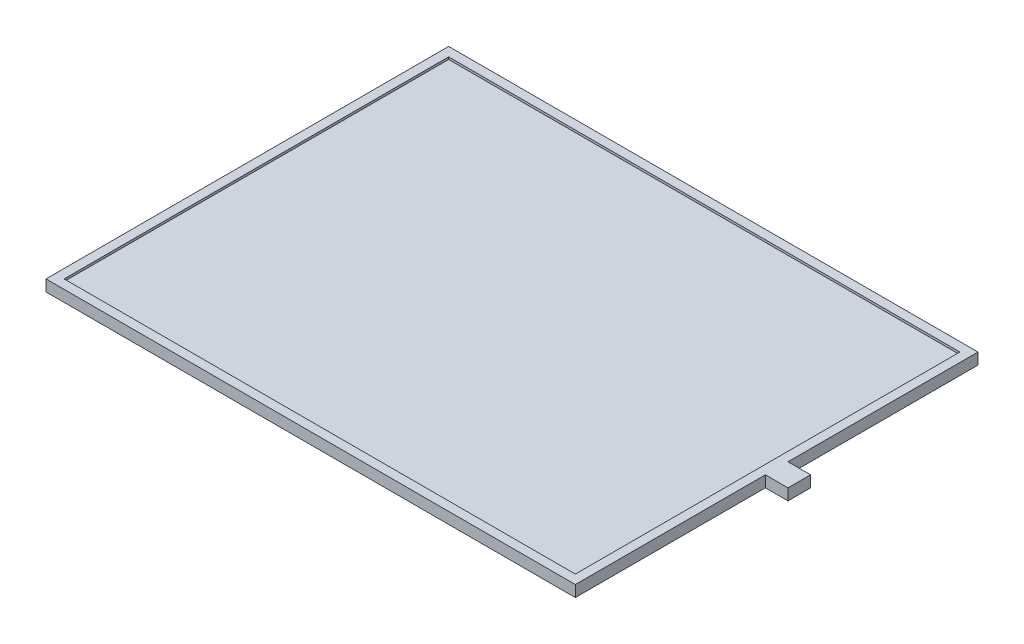
ISO-10303-21;
HEADER;
FILE_DESCRIPTION(('STEP AP214'),'2;1');
FILE_NAME('part.step','',(''),(''),'','','');
FILE_SCHEMA(('AUTOMOTIVE_DESIGN { 1 0 10303 214 1 1 1 1 }'));
ENDSEC;
DATA;
#1=APPLICATION_CONTEXT('core data for automotive mechanical design processes');
#2=APPLICATION_PROTOCOL_DEFINITION('international standard','automotive_design',2000,#1);
#3=PRODUCT_CONTEXT('',#1,'mechanical');
#4=PRODUCT('Part','Part','',(#3));
#5=PRODUCT_RELATED_PRODUCT_CATEGORY('part','',(#4));
#6=PRODUCT_DEFINITION_FORMATION('','',#4);
#7=PRODUCT_DEFINITION_CONTEXT('part definition',#1,'design');
#8=PRODUCT_DEFINITION('design','',#6,#7);
#9=PRODUCT_DEFINITION_SHAPE('','',#8);
#10=(LENGTH_UNIT() NAMED_UNIT(*) SI_UNIT(.MILLI.,.METRE.));
#11=(NAMED_UNIT(*) PLANE_ANGLE_UNIT() SI_UNIT($,.RADIAN.));
#12=(NAMED_UNIT(*) SI_UNIT($,.STERADIAN.) SOLID_ANGLE_UNIT());
#13=UNCERTAINTY_MEASURE_WITH_UNIT(LENGTH_MEASURE(1.E-05),#10,'distance_accuracy_value','');
#14=(GEOMETRIC_REPRESENTATION_CONTEXT(3) GLOBAL_UNCERTAINTY_ASSIGNED_CONTEXT((#13)) GLOBAL_UNIT_ASSIGNED_CONTEXT((#10,
#11,#12)) REPRESENTATION_CONTEXT('',''));
#15=CARTESIAN_POINT('',(0.,0.,0.));
#16=DIRECTION('',(0.,0.,1.));
#17=DIRECTION('',(1.,0.,0.));
#18=AXIS2_PLACEMENT_3D('',#15,#16,#17);
#19=CARTESIAN_POINT('',(0.,5.,0.));
#20=DIRECTION('',(0.,1.,0.));
#21=DIRECTION('',(0.,0.,1.));
#22=AXIS2_PLACEMENT_3D('',#19,#20,#21);
#23=PLANE('',#22);
#24=DIRECTION('',(0.,0.,1.));
#25=VECTOR('',#24,1.);
#26=CARTESIAN_POINT('',(0.,5.,0.));
#27=LINE('',#26,#25);
#28=CARTESIAN_POINT('',(0.,5.,0.));
#29=VERTEX_POINT('',#28);
#30=CARTESIAN_POINT('',(0.,5.,178.));
#31=VERTEX_POINT('',#30);
#32=EDGE_CURVE('E183',#29,#31,#27,.T.);
#33=ORIENTED_EDGE('',*,*,#32,.T.);
#34=DIRECTION('',(1.,0.,0.));
#35=VECTOR('',#34,1.);
#36=CARTESIAN_POINT('',(0.,5.,178.));
#37=LINE('',#36,#35);
#38=CARTESIAN_POINT('',(234.,5.,178.));
#39=VERTEX_POINT('',#38);
#40=EDGE_CURVE('E187',#31,#39,#37,.T.);
#41=ORIENTED_EDGE('',*,*,#40,.T.);
#42=DIRECTION('',(0.,0.,-1.));
#43=VECTOR('',#42,1.);
#44=CARTESIAN_POINT('',(234.,5.,94.));
#45=LINE('',#44,#43);
#46=CARTESIAN_POINT('',(234.,5.,94.));
#47=VERTEX_POINT('',#46);
#48=EDGE_CURVE('E191',#39,#47,#45,.T.);
#49=ORIENTED_EDGE('',*,*,#48,.T.);
#50=DIRECTION('',(1.,0.,0.));
#51=VECTOR('',#50,1.);
#52=CARTESIAN_POINT('',(234.,5.,94.));
#53=LINE('',#52,#51);
#54=CARTESIAN_POINT('',(244.,5.,94.));
#55=VERTEX_POINT('',#54);
#56=EDGE_CURVE('E194',#47,#55,#53,.T.);
#57=ORIENTED_EDGE('',*,*,#56,.T.);
#58=DIRECTION('',(0.,0.,-1.));
#59=VECTOR('',#58,1.);
#60=CARTESIAN_POINT('',(244.,5.,84.));
#61=LINE('',#60,#59);
#62=CARTESIAN_POINT('',(244.,5.,84.));
#63=VERTEX_POINT('',#62);
#64=EDGE_CURVE('E197',#55,#63,#61,.T.);
#65=ORIENTED_EDGE('',*,*,#64,.T.);
#66=DIRECTION('',(-1.,0.,0.));
#67=VECTOR('',#66,1.);
#68=CARTESIAN_POINT('',(234.,5.,84.));
#69=LINE('',#68,#67);
#70=CARTESIAN_POINT('',(234.,5.,84.));
#71=VERTEX_POINT('',#70);
#72=EDGE_CURVE('E200',#63,#71,#69,.T.);
#73=ORIENTED_EDGE('',*,*,#72,.T.);
#74=DIRECTION('',(0.,0.,-1.));
#75=VECTOR('',#74,1.);
#76=CARTESIAN_POINT('',(234.,5.,0.));
#77=LINE('',#76,#75);
#78=CARTESIAN_POINT('',(234.,5.,0.));
#79=VERTEX_POINT('',#78);
#80=EDGE_CURVE('E203',#71,#79,#77,.T.);
#81=ORIENTED_EDGE('',*,*,#80,.T.);
#82=DIRECTION('',(-1.,0.,0.));
#83=VECTOR('',#82,1.);
#84=CARTESIAN_POINT('',(0.,5.,0.));
#85=LINE('',#84,#83);
#86=EDGE_CURVE('E206',#79,#29,#85,.T.);
#87=ORIENTED_EDGE('',*,*,#86,.T.);
#88=EDGE_LOOP('',(#33,#41,#49,#57,#65,#73,#81,#87));
#89=FACE_BOUND('',#88,.T.);
#90=DIRECTION('',(1.,0.,0.));
#91=VECTOR('',#90,1.);
#92=CARTESIAN_POINT('',(4.00000000000002,5.,174.));
#93=LINE('',#92,#91);
#94=CARTESIAN_POINT('',(4.00000000000002,5.,174.));
#95=VERTEX_POINT('',#94);
#96=CARTESIAN_POINT('',(230.,5.,174.));
#97=VERTEX_POINT('',#96);
#98=EDGE_CURVE('E162',#95,#97,#93,.T.);
#99=ORIENTED_EDGE('',*,*,#98,.F.);
#100=DIRECTION('',(0.,0.,1.));
#101=VECTOR('',#100,1.);
#102=CARTESIAN_POINT('',(4.,5.,4.));
#103=LINE('',#102,#101);
#104=CARTESIAN_POINT('',(4.,5.,4.));
#105=VERTEX_POINT('',#104);
#106=EDGE_CURVE('E158',#105,#95,#103,.T.);
#107=ORIENTED_EDGE('',*,*,#106,.F.);
#108=DIRECTION('',(-1.,0.,0.));
#109=VECTOR('',#108,1.);
#110=CARTESIAN_POINT('',(4.,5.,4.));
#111=LINE('',#110,#109);
#112=CARTESIAN_POINT('',(230.,5.,4.));
#113=VERTEX_POINT('',#112);
#114=EDGE_CURVE('E143',#113,#105,#111,.T.);
#115=ORIENTED_EDGE('',*,*,#114,.F.);
#116=DIRECTION('',(0.,0.,-1.));
#117=VECTOR('',#116,1.);
#118=CARTESIAN_POINT('',(230.,5.,4.));
#119=LINE('',#118,#117);
#120=EDGE_CURVE('E169',#97,#113,#119,.T.);
#121=ORIENTED_EDGE('',*,*,#120,.F.);
#122=EDGE_LOOP('',(#99,#107,#115,#121));
#123=FACE_BOUND('',#122,.T.);
#124=ADVANCED_FACE('F45',(#89,#123),#23,.T.);
#125=CARTESIAN_POINT('',(0.,0.,0.));
#126=DIRECTION('',(0.,1.,0.));
#127=DIRECTION('',(0.,0.,1.));
#128=AXIS2_PLACEMENT_3D('',#125,#126,#127);
#129=PLANE('',#128);
#130=DIRECTION('',(0.,0.,1.));
#131=VECTOR('',#130,1.);
#132=CARTESIAN_POINT('',(0.,0.,0.));
#133=LINE('',#132,#131);
#134=CARTESIAN_POINT('',(0.,0.,0.));
#135=VERTEX_POINT('',#134);
#136=CARTESIAN_POINT('',(0.,0.,178.));
#137=VERTEX_POINT('',#136);
#138=EDGE_CURVE('E182',#135,#137,#133,.T.);
#139=ORIENTED_EDGE('',*,*,#138,.F.);
#140=DIRECTION('',(-1.,0.,0.));
#141=VECTOR('',#140,1.);
#142=CARTESIAN_POINT('',(0.,0.,0.));
#143=LINE('',#142,#141);
#144=CARTESIAN_POINT('',(234.,0.,0.));
#145=VERTEX_POINT('',#144);
#146=EDGE_CURVE('E188',#145,#135,#143,.T.);
#147=ORIENTED_EDGE('',*,*,#146,.F.);
#148=DIRECTION('',(0.,0.,-1.));
#149=VECTOR('',#148,1.);
#150=CARTESIAN_POINT('',(234.,0.,0.));
#151=LINE('',#150,#149);
#152=CARTESIAN_POINT('',(234.,0.,84.));
#153=VERTEX_POINT('',#152);
#154=EDGE_CURVE('E228',#153,#145,#151,.T.);
#155=ORIENTED_EDGE('',*,*,#154,.F.);
#156=DIRECTION('',(-1.,0.,0.));
#157=VECTOR('',#156,1.);
#158=CARTESIAN_POINT('',(234.,0.,84.));
#159=LINE('',#158,#157);
#160=CARTESIAN_POINT('',(244.,0.,84.));
#161=VERTEX_POINT('',#160);
#162=EDGE_CURVE('E225',#161,#153,#159,.T.);
#163=ORIENTED_EDGE('',*,*,#162,.F.);
#164=DIRECTION('',(0.,0.,-1.));
#165=VECTOR('',#164,1.);
#166=CARTESIAN_POINT('',(244.,0.,84.));
#167=LINE('',#166,#165);
#168=CARTESIAN_POINT('',(244.,0.,94.));
#169=VERTEX_POINT('',#168);
#170=EDGE_CURVE('E222',#169,#161,#167,.T.);
#171=ORIENTED_EDGE('',*,*,#170,.F.);
#172=DIRECTION('',(1.,0.,0.));
#173=VECTOR('',#172,1.);
#174=CARTESIAN_POINT('',(234.,0.,94.));
#175=LINE('',#174,#173);
#176=CARTESIAN_POINT('',(234.,0.,94.));
#177=VERTEX_POINT('',#176);
#178=EDGE_CURVE('E219',#177,#169,#175,.T.);
#179=ORIENTED_EDGE('',*,*,#178,.F.);
#180=DIRECTION('',(0.,0.,-1.));
#181=VECTOR('',#180,1.);
#182=CARTESIAN_POINT('',(234.,0.,94.));
#183=LINE('',#182,#181);
#184=CARTESIAN_POINT('',(234.,0.,178.));
#185=VERTEX_POINT('',#184);
#186=EDGE_CURVE('E216',#185,#177,#183,.T.);
#187=ORIENTED_EDGE('',*,*,#186,.F.);
#188=DIRECTION('',(1.,0.,0.));
#189=VECTOR('',#188,1.);
#190=CARTESIAN_POINT('',(0.,0.,178.));
#191=LINE('',#190,#189);
#192=EDGE_CURVE('E213',#137,#185,#191,.T.);
#193=ORIENTED_EDGE('',*,*,#192,.F.);
#194=EDGE_LOOP('',(#139,#147,#155,#163,#171,#179,#187,#193));
#195=FACE_BOUND('',#194,.T.);
#196=ADVANCED_FACE('F267',(#195),#129,.F.);
#197=CARTESIAN_POINT('',(0.,5.,0.));
#198=DIRECTION('',(1.,0.,0.));
#199=DIRECTION('',(0.,0.,-1.));
#200=AXIS2_PLACEMENT_3D('',#197,#198,#199);
#201=PLANE('',#200);
#202=ORIENTED_EDGE('',*,*,#138,.T.);
#203=DIRECTION('',(0.,-1.,0.));
#204=VECTOR('',#203,1.);
#205=CARTESIAN_POINT('',(0.,5.,178.));
#206=LINE('',#205,#204);
#207=EDGE_CURVE('E11',#31,#137,#206,.T.);
#208=ORIENTED_EDGE('',*,*,#207,.F.);
#209=ORIENTED_EDGE('',*,*,#32,.F.);
#210=DIRECTION('',(0.,-1.,0.));
#211=VECTOR('',#210,1.);
#212=CARTESIAN_POINT('',(0.,5.,0.));
#213=LINE('',#212,#211);
#214=EDGE_CURVE('E209',#29,#135,#213,.T.);
#215=ORIENTED_EDGE('',*,*,#214,.T.);
#216=EDGE_LOOP('',(#202,#208,#209,#215));
#217=FACE_BOUND('',#216,.T.);
#218=ADVANCED_FACE('F47',(#217),#201,.F.);
#219=CARTESIAN_POINT('',(0.,5.,178.));
#220=DIRECTION('',(0.,0.,-1.));
#221=DIRECTION('',(-1.,0.,0.));
#222=AXIS2_PLACEMENT_3D('',#219,#220,#221);
#223=PLANE('',#222);
#224=ORIENTED_EDGE('',*,*,#192,.T.);
#225=DIRECTION('',(0.,-1.,0.));
#226=VECTOR('',#225,1.);
#227=CARTESIAN_POINT('',(234.,5.,178.));
#228=LINE('',#227,#226);
#229=EDGE_CURVE('E54',#39,#185,#228,.T.);
#230=ORIENTED_EDGE('',*,*,#229,.F.);
#231=ORIENTED_EDGE('',*,*,#40,.F.);
#232=ORIENTED_EDGE('',*,*,#207,.T.);
#233=EDGE_LOOP('',(#224,#230,#231,#232));
#234=FACE_BOUND('',#233,.T.);
#235=ADVANCED_FACE('F284',(#234),#223,.F.);
#236=CARTESIAN_POINT('',(234.,5.,94.));
#237=DIRECTION('',(-1.,0.,0.));
#238=DIRECTION('',(0.,0.,1.));
#239=AXIS2_PLACEMENT_3D('',#236,#237,#238);
#240=PLANE('',#239);
#241=ORIENTED_EDGE('',*,*,#186,.T.);
#242=DIRECTION('',(0.,-1.,0.));
#243=VECTOR('',#242,1.);
#244=CARTESIAN_POINT('',(234.,5.,94.));
#245=LINE('',#244,#243);
#246=EDGE_CURVE('E252',#47,#177,#245,.T.);
#247=ORIENTED_EDGE('',*,*,#246,.F.);
#248=ORIENTED_EDGE('',*,*,#48,.F.);
#249=ORIENTED_EDGE('',*,*,#229,.T.);
#250=EDGE_LOOP('',(#241,#247,#248,#249));
#251=FACE_BOUND('',#250,.T.);
#252=ADVANCED_FACE('F261',(#251),#240,.F.);
#253=CARTESIAN_POINT('',(234.,5.,94.));
#254=DIRECTION('',(0.,0.,-1.));
#255=DIRECTION('',(-1.,0.,0.));
#256=AXIS2_PLACEMENT_3D('',#253,#254,#255);
#257=PLANE('',#256);
#258=ORIENTED_EDGE('',*,*,#178,.T.);
#259=DIRECTION('',(0.,-1.,0.));
#260=VECTOR('',#259,1.);
#261=CARTESIAN_POINT('',(244.,5.,94.));
#262=LINE('',#261,#260);
#263=EDGE_CURVE('E248',#55,#169,#262,.T.);
#264=ORIENTED_EDGE('',*,*,#263,.F.);
#265=ORIENTED_EDGE('',*,*,#56,.F.);
#266=ORIENTED_EDGE('',*,*,#246,.T.);
#267=EDGE_LOOP('',(#258,#264,#265,#266));
#268=FACE_BOUND('',#267,.T.);
#269=ADVANCED_FACE('F272',(#268),#257,.F.);
#270=CARTESIAN_POINT('',(244.,5.,84.));
#271=DIRECTION('',(-1.,0.,0.));
#272=DIRECTION('',(0.,0.,1.));
#273=AXIS2_PLACEMENT_3D('',#270,#271,#272);
#274=PLANE('',#273);
#275=ORIENTED_EDGE('',*,*,#170,.T.);
#276=DIRECTION('',(0.,-1.,0.));
#277=VECTOR('',#276,1.);
#278=CARTESIAN_POINT('',(244.,5.,84.));
#279=LINE('',#278,#277);
#280=EDGE_CURVE('E244',#63,#161,#279,.T.);
#281=ORIENTED_EDGE('',*,*,#280,.F.);
#282=ORIENTED_EDGE('',*,*,#64,.F.);
#283=ORIENTED_EDGE('',*,*,#263,.T.);
#284=EDGE_LOOP('',(#275,#281,#282,#283));
#285=FACE_BOUND('',#284,.T.);
#286=ADVANCED_FACE('F276',(#285),#274,.F.);
#287=CARTESIAN_POINT('',(234.,5.,84.));
#288=DIRECTION('',(0.,0.,1.));
#289=DIRECTION('',(1.,0.,0.));
#290=AXIS2_PLACEMENT_3D('',#287,#288,#289);
#291=PLANE('',#290);
#292=ORIENTED_EDGE('',*,*,#162,.T.);
#293=DIRECTION('',(0.,-1.,0.));
#294=VECTOR('',#293,1.);
#295=CARTESIAN_POINT('',(234.,5.,84.));
#296=LINE('',#295,#294);
#297=EDGE_CURVE('E240',#71,#153,#296,.T.);
#298=ORIENTED_EDGE('',*,*,#297,.F.);
#299=ORIENTED_EDGE('',*,*,#72,.F.);
#300=ORIENTED_EDGE('',*,*,#280,.T.);
#301=EDGE_LOOP('',(#292,#298,#299,#300));
#302=FACE_BOUND('',#301,.T.);
#303=ADVANCED_FACE('F297',(#302),#291,.F.);
#304=CARTESIAN_POINT('',(234.,5.,0.));
#305=DIRECTION('',(-1.,0.,0.));
#306=DIRECTION('',(0.,0.,1.));
#307=AXIS2_PLACEMENT_3D('',#304,#305,#306);
#308=PLANE('',#307);
#309=ORIENTED_EDGE('',*,*,#154,.T.);
#310=DIRECTION('',(0.,-1.,0.));
#311=VECTOR('',#310,1.);
#312=CARTESIAN_POINT('',(234.,5.,0.));
#313=LINE('',#312,#311);
#314=EDGE_CURVE('E236',#79,#145,#313,.T.);
#315=ORIENTED_EDGE('',*,*,#314,.F.);
#316=ORIENTED_EDGE('',*,*,#80,.F.);
#317=ORIENTED_EDGE('',*,*,#297,.T.);
#318=EDGE_LOOP('',(#309,#315,#316,#317));
#319=FACE_BOUND('',#318,.T.);
#320=ADVANCED_FACE('F295',(#319),#308,.F.);
#321=CARTESIAN_POINT('',(0.,5.,0.));
#322=DIRECTION('',(0.,0.,1.));
#323=DIRECTION('',(1.,0.,0.));
#324=AXIS2_PLACEMENT_3D('',#321,#322,#323);
#325=PLANE('',#324);
#326=ORIENTED_EDGE('',*,*,#146,.T.);
#327=ORIENTED_EDGE('',*,*,#214,.F.);
#328=ORIENTED_EDGE('',*,*,#86,.F.);
#329=ORIENTED_EDGE('',*,*,#314,.T.);
#330=EDGE_LOOP('',(#326,#327,#328,#329));
#331=FACE_BOUND('',#330,.T.);
#332=ADVANCED_FACE('F290',(#331),#325,.F.);
#333=CARTESIAN_POINT('',(4.,5.,4.));
#334=DIRECTION('',(1.,0.,0.));
#335=DIRECTION('',(0.,0.,-1.));
#336=AXIS2_PLACEMENT_3D('',#333,#334,#335);
#337=PLANE('',#336);
#338=DIRECTION('',(0.,0.,1.));
#339=VECTOR('',#338,1.);
#340=CARTESIAN_POINT('',(4.,4.,4.));
#341=LINE('',#340,#339);
#342=CARTESIAN_POINT('',(4.,4.,4.));
#343=VERTEX_POINT('',#342);
#344=CARTESIAN_POINT('',(4.00000000000002,4.,174.));
#345=VERTEX_POINT('',#344);
#346=EDGE_CURVE('E150',#343,#345,#341,.T.);
#347=ORIENTED_EDGE('',*,*,#346,.F.);
#348=DIRECTION('',(0.,-1.,0.));
#349=VECTOR('',#348,1.);
#350=CARTESIAN_POINT('',(4.,5.,4.));
#351=LINE('',#350,#349);
#352=EDGE_CURVE('E137',#105,#343,#351,.T.);
#353=ORIENTED_EDGE('',*,*,#352,.F.);
#354=ORIENTED_EDGE('',*,*,#106,.T.);
#355=DIRECTION('',(0.,-1.,0.));
#356=VECTOR('',#355,1.);
#357=CARTESIAN_POINT('',(4.00000000000002,5.,174.));
#358=LINE('',#357,#356);
#359=EDGE_CURVE('E152',#95,#345,#358,.T.);
#360=ORIENTED_EDGE('',*,*,#359,.T.);
#361=EDGE_LOOP('',(#347,#353,#354,#360));
#362=FACE_BOUND('',#361,.T.);
#363=ADVANCED_FACE('F151',(#362),#337,.T.);
#364=CARTESIAN_POINT('',(4.00000000000002,5.,174.));
#365=DIRECTION('',(0.,0.,-1.));
#366=DIRECTION('',(-1.,0.,0.));
#367=AXIS2_PLACEMENT_3D('',#364,#365,#366);
#368=PLANE('',#367);
#369=DIRECTION('',(1.,0.,0.));
#370=VECTOR('',#369,1.);
#371=CARTESIAN_POINT('',(4.,4.,174.));
#372=LINE('',#371,#370);
#373=CARTESIAN_POINT('',(230.,4.,174.));
#374=VERTEX_POINT('',#373);
#375=EDGE_CURVE('E61',#345,#374,#372,.T.);
#376=ORIENTED_EDGE('',*,*,#375,.F.);
#377=ORIENTED_EDGE('',*,*,#359,.F.);
#378=ORIENTED_EDGE('',*,*,#98,.T.);
#379=DIRECTION('',(0.,-1.,0.));
#380=VECTOR('',#379,1.);
#381=CARTESIAN_POINT('',(230.,5.,174.));
#382=LINE('',#381,#380);
#383=EDGE_CURVE('E177',#97,#374,#382,.T.);
#384=ORIENTED_EDGE('',*,*,#383,.T.);
#385=EDGE_LOOP('',(#376,#377,#378,#384));
#386=FACE_BOUND('',#385,.T.);
#387=ADVANCED_FACE('F320',(#386),#368,.T.);
#388=CARTESIAN_POINT('',(230.,5.,4.));
#389=DIRECTION('',(-1.,0.,0.));
#390=DIRECTION('',(0.,0.,1.));
#391=AXIS2_PLACEMENT_3D('',#388,#389,#390);
#392=PLANE('',#391);
#393=DIRECTION('',(0.,0.,-1.));
#394=VECTOR('',#393,1.);
#395=CARTESIAN_POINT('',(230.,4.,4.));
#396=LINE('',#395,#394);
#397=CARTESIAN_POINT('',(230.,4.,4.));
#398=VERTEX_POINT('',#397);
#399=EDGE_CURVE('E69',#374,#398,#396,.T.);
#400=ORIENTED_EDGE('',*,*,#399,.F.);
#401=ORIENTED_EDGE('',*,*,#383,.F.);
#402=ORIENTED_EDGE('',*,*,#120,.T.);
#403=DIRECTION('',(0.,-1.,0.));
#404=VECTOR('',#403,1.);
#405=CARTESIAN_POINT('',(230.,5.,4.));
#406=LINE('',#405,#404);
#407=EDGE_CURVE('E147',#113,#398,#406,.T.);
#408=ORIENTED_EDGE('',*,*,#407,.T.);
#409=EDGE_LOOP('',(#400,#401,#402,#408));
#410=FACE_BOUND('',#409,.T.);
#411=ADVANCED_FACE('F324',(#410),#392,.T.);
#412=CARTESIAN_POINT('',(4.,5.,4.));
#413=DIRECTION('',(0.,0.,1.));
#414=DIRECTION('',(1.,0.,0.));
#415=AXIS2_PLACEMENT_3D('',#412,#413,#414);
#416=PLANE('',#415);
#417=DIRECTION('',(-1.,0.,0.));
#418=VECTOR('',#417,1.);
#419=CARTESIAN_POINT('',(4.,4.,4.));
#420=LINE('',#419,#418);
#421=EDGE_CURVE('E141',#398,#343,#420,.T.);
#422=ORIENTED_EDGE('',*,*,#421,.F.);
#423=ORIENTED_EDGE('',*,*,#407,.F.);
#424=ORIENTED_EDGE('',*,*,#114,.T.);
#425=ORIENTED_EDGE('',*,*,#352,.T.);
#426=EDGE_LOOP('',(#422,#423,#424,#425));
#427=FACE_BOUND('',#426,.T.);
#428=ADVANCED_FACE('F139',(#427),#416,.T.);
#429=CARTESIAN_POINT('',(0.,4.,0.));
#430=DIRECTION('',(0.,1.,0.));
#431=DIRECTION('',(0.,0.,1.));
#432=AXIS2_PLACEMENT_3D('',#429,#430,#431);
#433=PLANE('',#432);
#434=ORIENTED_EDGE('',*,*,#346,.T.);
#435=ORIENTED_EDGE('',*,*,#375,.T.);
#436=ORIENTED_EDGE('',*,*,#399,.T.);
#437=ORIENTED_EDGE('',*,*,#421,.T.);
#438=EDGE_LOOP('',(#434,#435,#436,#437));
#439=FACE_BOUND('',#438,.T.);
#440=ADVANCED_FACE('F156',(#439),#433,.T.);
#441=CLOSED_SHELL('',(#124,#196,#218,#235,#252,#269,#286,#303,#320,#332,#363,#387,#411,#428,#440));
#442=MANIFOLD_SOLID_BREP('B2',#441);
#443=ADVANCED_BREP_SHAPE_REPRESENTATION('',(#18,#442),#14);
#444=SHAPE_DEFINITION_REPRESENTATION(#9,#443);
ENDSEC;
END-ISO-10303-21;
